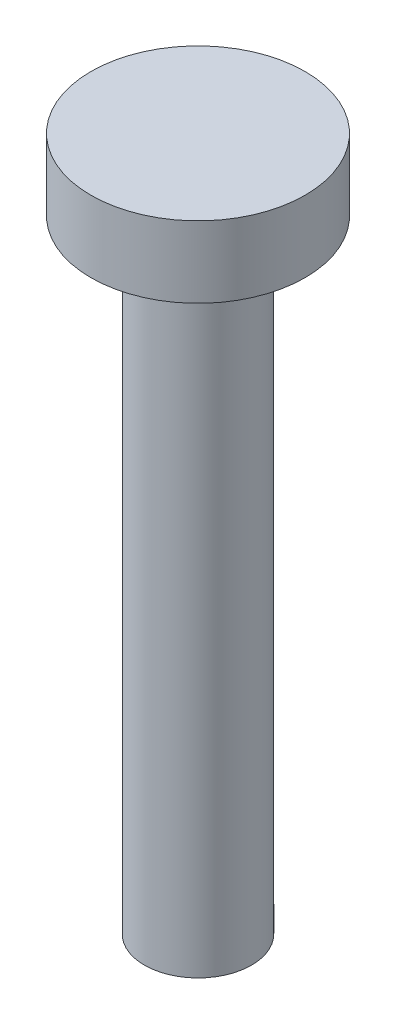
ISO-10303-21;
HEADER;
FILE_DESCRIPTION(('STEP AP214'),'2;1');
FILE_NAME('part.step','',(''),(''),'','','');
FILE_SCHEMA(('AUTOMOTIVE_DESIGN { 1 0 10303 214 1 1 1 1 }'));
ENDSEC;
DATA;
#1=APPLICATION_CONTEXT('core data for automotive mechanical design processes');
#2=APPLICATION_PROTOCOL_DEFINITION('international standard','automotive_design',2000,#1);
#3=PRODUCT_CONTEXT('',#1,'mechanical');
#4=PRODUCT('Part','Part','',(#3));
#5=PRODUCT_RELATED_PRODUCT_CATEGORY('part','',(#4));
#6=PRODUCT_DEFINITION_FORMATION('','',#4);
#7=PRODUCT_DEFINITION_CONTEXT('part definition',#1,'design');
#8=PRODUCT_DEFINITION('design','',#6,#7);
#9=PRODUCT_DEFINITION_SHAPE('','',#8);
#10=(LENGTH_UNIT() NAMED_UNIT(*) SI_UNIT(.MILLI.,.METRE.));
#11=(NAMED_UNIT(*) PLANE_ANGLE_UNIT() SI_UNIT($,.RADIAN.));
#12=(NAMED_UNIT(*) SI_UNIT($,.STERADIAN.) SOLID_ANGLE_UNIT());
#13=UNCERTAINTY_MEASURE_WITH_UNIT(LENGTH_MEASURE(1.E-05),#10,'distance_accuracy_value','');
#14=(GEOMETRIC_REPRESENTATION_CONTEXT(3) GLOBAL_UNCERTAINTY_ASSIGNED_CONTEXT((#13)) GLOBAL_UNIT_ASSIGNED_CONTEXT((#10,
#11,#12)) REPRESENTATION_CONTEXT('',''));
#15=CARTESIAN_POINT('',(0.,0.,0.));
#16=DIRECTION('',(0.,0.,1.));
#17=DIRECTION('',(1.,0.,0.));
#18=AXIS2_PLACEMENT_3D('',#15,#16,#17);
#19=CARTESIAN_POINT('',(0.,53.22,11.));
#20=DIRECTION('',(0.,-1.,0.));
#21=DIRECTION('',(0.,0.,-1.));
#22=AXIS2_PLACEMENT_3D('',#19,#20,#21);
#23=CYLINDRICAL_SURFACE('',#22,1.5);
#24=DIRECTION('',(0.,-1.,0.));
#25=VECTOR('',#24,1.);
#26=CARTESIAN_POINT('',(-1.5,42.01,11.));
#27=LINE('',#26,#25);
#28=CARTESIAN_POINT('',(-1.5,53.22,11.));
#29=VERTEX_POINT('',#28);
#30=CARTESIAN_POINT('',(-1.5,35.8,11.));
#31=VERTEX_POINT('',#30);
#32=EDGE_CURVE('E11',#29,#31,#27,.T.);
#33=ORIENTED_EDGE('',*,*,#32,.T.);
#34=CARTESIAN_POINT('',(0.,35.8,11.));
#35=DIRECTION('',(0.,-1.,0.));
#36=DIRECTION('',(0.,0.,-1.));
#37=AXIS2_PLACEMENT_3D('',#34,#35,#36);
#38=CIRCLE('',#37,1.5);
#39=EDGE_CURVE('E60',#31,#31,#38,.T.);
#40=ORIENTED_EDGE('',*,*,#39,.F.);
#41=ORIENTED_EDGE('',*,*,#32,.F.);
#42=CARTESIAN_POINT('',(0.,53.22,11.));
#43=DIRECTION('',(0.,-1.,0.));
#44=DIRECTION('',(-1.,0.,0.));
#45=AXIS2_PLACEMENT_3D('',#42,#43,#44);
#46=CIRCLE('',#45,1.5);
#47=CARTESIAN_POINT('',(1.5,53.22,11.));
#48=VERTEX_POINT('',#47);
#49=EDGE_CURVE('E54',#29,#48,#46,.T.);
#50=ORIENTED_EDGE('',*,*,#49,.T.);
#51=CARTESIAN_POINT('',(0.,53.22,11.));
#52=DIRECTION('',(0.,-1.,0.));
#53=DIRECTION('',(1.,0.,0.));
#54=AXIS2_PLACEMENT_3D('',#51,#52,#53);
#55=CIRCLE('',#54,1.5);
#56=EDGE_CURVE('E80',#48,#29,#55,.T.);
#57=ORIENTED_EDGE('',*,*,#56,.T.);
#58=EDGE_LOOP('',(#33,#40,#41,#50,#57));
#59=FACE_BOUND('',#58,.T.);
#60=ADVANCED_FACE('F44',(#59),#23,.T.);
#61=CARTESIAN_POINT('',(3.01,55.22,7.99));
#62=DIRECTION('',(0.,1.,0.));
#63=DIRECTION('',(-1.,0.,0.));
#64=AXIS2_PLACEMENT_3D('',#61,#62,#63);
#65=PLANE('',#64);
#66=CARTESIAN_POINT('',(0.,55.22,11.));
#67=DIRECTION('',(0.,1.,0.));
#68=DIRECTION('',(1.,0.,0.));
#69=AXIS2_PLACEMENT_3D('',#66,#67,#68);
#70=CIRCLE('',#69,3.);
#71=CARTESIAN_POINT('',(3.,55.22,11.));
#72=VERTEX_POINT('',#71);
#73=EDGE_CURVE('E75',#72,#72,#70,.T.);
#74=ORIENTED_EDGE('',*,*,#73,.T.);
#75=EDGE_LOOP('',(#74));
#76=FACE_BOUND('',#75,.T.);
#77=ADVANCED_FACE('F76',(#76),#65,.T.);
#78=CARTESIAN_POINT('',(-3.01,53.22,7.99));
#79=DIRECTION('',(0.,-1.,0.));
#80=DIRECTION('',(1.,0.,0.));
#81=AXIS2_PLACEMENT_3D('',#78,#79,#80);
#82=PLANE('',#81);
#83=ORIENTED_EDGE('',*,*,#56,.F.);
#84=ORIENTED_EDGE('',*,*,#49,.F.);
#85=EDGE_LOOP('',(#83,#84));
#86=FACE_BOUND('',#85,.T.);
#87=CARTESIAN_POINT('',(0.,53.22,11.));
#88=DIRECTION('',(0.,-1.,0.));
#89=DIRECTION('',(1.,0.,0.));
#90=AXIS2_PLACEMENT_3D('',#87,#88,#89);
#91=CIRCLE('',#90,3.);
#92=CARTESIAN_POINT('',(3.,53.22,11.));
#93=VERTEX_POINT('',#92);
#94=EDGE_CURVE('E48',#93,#93,#91,.T.);
#95=ORIENTED_EDGE('',*,*,#94,.T.);
#96=EDGE_LOOP('',(#95));
#97=FACE_BOUND('',#96,.T.);
#98=ADVANCED_FACE('F98',(#86,#97),#82,.T.);
#99=CARTESIAN_POINT('',(0.,53.22,11.));
#100=DIRECTION('',(0.,1.,0.));
#101=DIRECTION('',(0.,0.,1.));
#102=AXIS2_PLACEMENT_3D('',#99,#100,#101);
#103=CYLINDRICAL_SURFACE('',#102,3.);
#104=ORIENTED_EDGE('',*,*,#94,.F.);
#105=DIRECTION('',(0.,1.,0.));
#106=VECTOR('',#105,1.);
#107=CARTESIAN_POINT('',(3.,54.22,11.));
#108=LINE('',#107,#106);
#109=EDGE_CURVE('E81',#93,#72,#108,.T.);
#110=ORIENTED_EDGE('',*,*,#109,.T.);
#111=ORIENTED_EDGE('',*,*,#73,.F.);
#112=ORIENTED_EDGE('',*,*,#109,.F.);
#113=EDGE_LOOP('',(#104,#110,#111,#112));
#114=FACE_BOUND('',#113,.T.);
#115=ADVANCED_FACE('F46',(#114),#103,.T.);
#116=CARTESIAN_POINT('',(0.,35.8,11.));
#117=DIRECTION('',(0.,-1.,0.));
#118=DIRECTION('',(0.,0.,-1.));
#119=AXIS2_PLACEMENT_3D('',#116,#117,#118);
#120=PLANE('',#119);
#121=ORIENTED_EDGE('',*,*,#39,.T.);
#122=EDGE_LOOP('',(#121));
#123=FACE_BOUND('',#122,.T.);
#124=ADVANCED_FACE('F100',(#123),#120,.T.);
#125=CLOSED_SHELL('',(#60,#77,#98,#115,#124));
#126=MANIFOLD_SOLID_BREP('B2',#125);
#127=ADVANCED_BREP_SHAPE_REPRESENTATION('',(#18,#126),#14);
#128=SHAPE_DEFINITION_REPRESENTATION(#9,#127);
ENDSEC;
END-ISO-10303-21;
